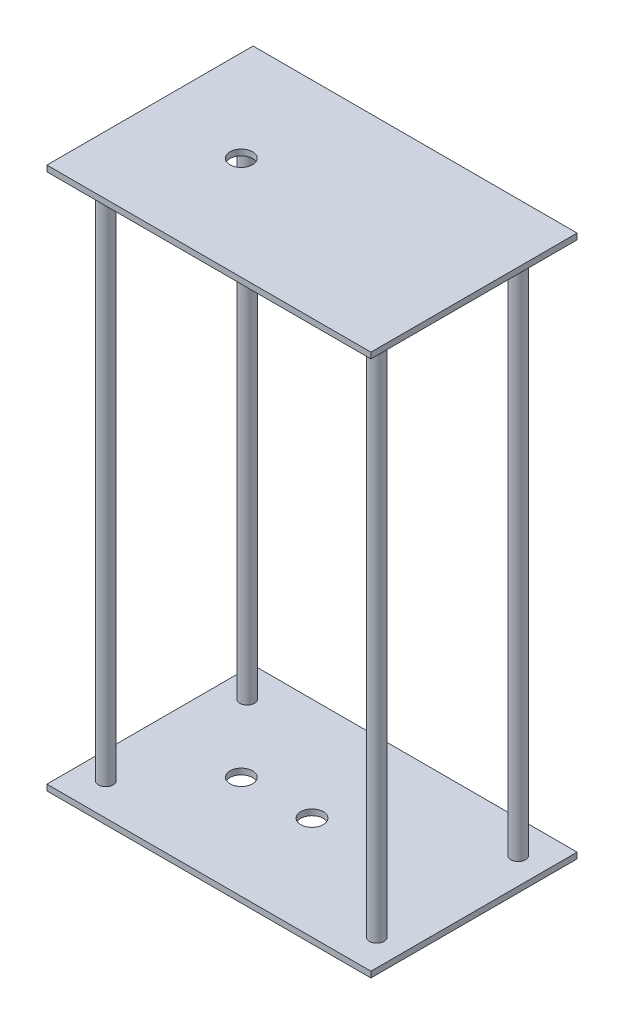
ISO-10303-21;
HEADER;
FILE_DESCRIPTION(('STEP AP214'),'2;1');
FILE_NAME('part.step','',(''),(''),'','','');
FILE_SCHEMA(('AUTOMOTIVE_DESIGN { 1 0 10303 214 1 1 1 1 }'));
ENDSEC;
DATA;
#1=APPLICATION_CONTEXT('core data for automotive mechanical design processes');
#2=APPLICATION_PROTOCOL_DEFINITION('international standard','automotive_design',2000,#1);
#3=PRODUCT_CONTEXT('',#1,'mechanical');
#4=PRODUCT('Part','Part','',(#3));
#5=PRODUCT_RELATED_PRODUCT_CATEGORY('part','',(#4));
#6=PRODUCT_DEFINITION_FORMATION('','',#4);
#7=PRODUCT_DEFINITION_CONTEXT('part definition',#1,'design');
#8=PRODUCT_DEFINITION('design','',#6,#7);
#9=PRODUCT_DEFINITION_SHAPE('','',#8);
#10=(LENGTH_UNIT() NAMED_UNIT(*) SI_UNIT(.MILLI.,.METRE.));
#11=(NAMED_UNIT(*) PLANE_ANGLE_UNIT() SI_UNIT($,.RADIAN.));
#12=(NAMED_UNIT(*) SI_UNIT($,.STERADIAN.) SOLID_ANGLE_UNIT());
#13=UNCERTAINTY_MEASURE_WITH_UNIT(LENGTH_MEASURE(1.E-05),#10,'distance_accuracy_value','');
#14=(GEOMETRIC_REPRESENTATION_CONTEXT(3) GLOBAL_UNCERTAINTY_ASSIGNED_CONTEXT((#13)) GLOBAL_UNIT_ASSIGNED_CONTEXT((#10,
#11,#12)) REPRESENTATION_CONTEXT('',''));
#15=CARTESIAN_POINT('',(0.,0.,0.));
#16=DIRECTION('',(0.,0.,1.));
#17=DIRECTION('',(1.,0.,0.));
#18=AXIS2_PLACEMENT_3D('',#15,#16,#17);
#19=CARTESIAN_POINT('',(-275.,10.,175.));
#20=DIRECTION('',(1.,0.,0.));
#21=DIRECTION('',(0.,0.,-1.));
#22=AXIS2_PLACEMENT_3D('',#19,#20,#21);
#23=PLANE('',#22);
#24=DIRECTION('',(0.,0.,1.));
#25=VECTOR('',#24,1.);
#26=CARTESIAN_POINT('',(-275.,0.,175.));
#27=LINE('',#26,#25);
#28=CARTESIAN_POINT('',(-275.,0.,-175.));
#29=VERTEX_POINT('',#28);
#30=CARTESIAN_POINT('',(-275.,0.,175.));
#31=VERTEX_POINT('',#30);
#32=EDGE_CURVE('E202',#29,#31,#27,.T.);
#33=ORIENTED_EDGE('',*,*,#32,.T.);
#34=DIRECTION('',(0.,-1.,0.));
#35=VECTOR('',#34,1.);
#36=CARTESIAN_POINT('',(-275.,10.,175.));
#37=LINE('',#36,#35);
#38=CARTESIAN_POINT('',(-275.,10.,175.));
#39=VERTEX_POINT('',#38);
#40=EDGE_CURVE('E11',#39,#31,#37,.T.);
#41=ORIENTED_EDGE('',*,*,#40,.F.);
#42=DIRECTION('',(0.,0.,1.));
#43=VECTOR('',#42,1.);
#44=CARTESIAN_POINT('',(-275.,10.,175.));
#45=LINE('',#44,#43);
#46=CARTESIAN_POINT('',(-275.,10.,-175.));
#47=VERTEX_POINT('',#46);
#48=EDGE_CURVE('E206',#47,#39,#45,.T.);
#49=ORIENTED_EDGE('',*,*,#48,.F.);
#50=DIRECTION('',(0.,-1.,0.));
#51=VECTOR('',#50,1.);
#52=CARTESIAN_POINT('',(-275.,10.,-175.));
#53=LINE('',#52,#51);
#54=EDGE_CURVE('E216',#47,#29,#53,.T.);
#55=ORIENTED_EDGE('',*,*,#54,.T.);
#56=EDGE_LOOP('',(#33,#41,#49,#55));
#57=FACE_BOUND('',#56,.T.);
#58=ADVANCED_FACE('F41',(#57),#23,.F.);
#59=CARTESIAN_POINT('',(275.,10.,175.));
#60=DIRECTION('',(0.,0.,-1.));
#61=DIRECTION('',(-1.,0.,0.));
#62=AXIS2_PLACEMENT_3D('',#59,#60,#61);
#63=PLANE('',#62);
#64=DIRECTION('',(1.,0.,0.));
#65=VECTOR('',#64,1.);
#66=CARTESIAN_POINT('',(275.,0.,175.));
#67=LINE('',#66,#65);
#68=CARTESIAN_POINT('',(275.,0.,175.));
#69=VERTEX_POINT('',#68);
#70=EDGE_CURVE('E220',#31,#69,#67,.T.);
#71=ORIENTED_EDGE('',*,*,#70,.T.);
#72=DIRECTION('',(0.,-1.,0.));
#73=VECTOR('',#72,1.);
#74=CARTESIAN_POINT('',(275.,10.,175.));
#75=LINE('',#74,#73);
#76=CARTESIAN_POINT('',(275.,10.,175.));
#77=VERTEX_POINT('',#76);
#78=EDGE_CURVE('E50',#77,#69,#75,.T.);
#79=ORIENTED_EDGE('',*,*,#78,.F.);
#80=DIRECTION('',(1.,0.,0.));
#81=VECTOR('',#80,1.);
#82=CARTESIAN_POINT('',(275.,10.,175.));
#83=LINE('',#82,#81);
#84=EDGE_CURVE('E89',#39,#77,#83,.T.);
#85=ORIENTED_EDGE('',*,*,#84,.F.);
#86=ORIENTED_EDGE('',*,*,#40,.T.);
#87=EDGE_LOOP('',(#71,#79,#85,#86));
#88=FACE_BOUND('',#87,.T.);
#89=ADVANCED_FACE('F250',(#88),#63,.F.);
#90=CARTESIAN_POINT('',(275.,10.,175.));
#91=DIRECTION('',(-1.,0.,0.));
#92=DIRECTION('',(0.,0.,1.));
#93=AXIS2_PLACEMENT_3D('',#90,#91,#92);
#94=PLANE('',#93);
#95=DIRECTION('',(0.,0.,-1.));
#96=VECTOR('',#95,1.);
#97=CARTESIAN_POINT('',(275.,0.,175.));
#98=LINE('',#97,#96);
#99=CARTESIAN_POINT('',(275.,0.,-175.));
#100=VERTEX_POINT('',#99);
#101=EDGE_CURVE('E76',#69,#100,#98,.T.);
#102=ORIENTED_EDGE('',*,*,#101,.T.);
#103=DIRECTION('',(0.,-1.,0.));
#104=VECTOR('',#103,1.);
#105=CARTESIAN_POINT('',(275.,10.,-175.));
#106=LINE('',#105,#104);
#107=CARTESIAN_POINT('',(275.,10.,-175.));
#108=VERTEX_POINT('',#107);
#109=EDGE_CURVE('E229',#108,#100,#106,.T.);
#110=ORIENTED_EDGE('',*,*,#109,.F.);
#111=DIRECTION('',(0.,0.,-1.));
#112=VECTOR('',#111,1.);
#113=CARTESIAN_POINT('',(275.,10.,175.));
#114=LINE('',#113,#112);
#115=EDGE_CURVE('E211',#77,#108,#114,.T.);
#116=ORIENTED_EDGE('',*,*,#115,.F.);
#117=ORIENTED_EDGE('',*,*,#78,.T.);
#118=EDGE_LOOP('',(#102,#110,#116,#117));
#119=FACE_BOUND('',#118,.T.);
#120=ADVANCED_FACE('F233',(#119),#94,.F.);
#121=CARTESIAN_POINT('',(275.,10.,-175.));
#122=DIRECTION('',(0.,0.,1.));
#123=DIRECTION('',(1.,0.,0.));
#124=AXIS2_PLACEMENT_3D('',#121,#122,#123);
#125=PLANE('',#124);
#126=DIRECTION('',(-1.,0.,0.));
#127=VECTOR('',#126,1.);
#128=CARTESIAN_POINT('',(275.,0.,-175.));
#129=LINE('',#128,#127);
#130=EDGE_CURVE('E82',#100,#29,#129,.T.);
#131=ORIENTED_EDGE('',*,*,#130,.T.);
#132=ORIENTED_EDGE('',*,*,#54,.F.);
#133=DIRECTION('',(-1.,0.,0.));
#134=VECTOR('',#133,1.);
#135=CARTESIAN_POINT('',(275.,10.,-175.));
#136=LINE('',#135,#134);
#137=EDGE_CURVE('E58',#108,#47,#136,.T.);
#138=ORIENTED_EDGE('',*,*,#137,.F.);
#139=ORIENTED_EDGE('',*,*,#109,.T.);
#140=EDGE_LOOP('',(#131,#132,#138,#139));
#141=FACE_BOUND('',#140,.T.);
#142=ADVANCED_FACE('F240',(#141),#125,.F.);
#143=CARTESIAN_POINT('',(0.,10.,0.));
#144=DIRECTION('',(0.,1.,0.));
#145=DIRECTION('',(0.,0.,1.));
#146=AXIS2_PLACEMENT_3D('',#143,#144,#145);
#147=PLANE('',#146);
#148=CARTESIAN_POINT('',(0.,10.,0.));
#149=DIRECTION('',(0.,1.,0.));
#150=DIRECTION('',(0.,0.,1.));
#151=AXIS2_PLACEMENT_3D('',#148,#149,#150);
#152=CIRCLE('',#151,19.15);
#153=CARTESIAN_POINT('',(0.,10.,19.15));
#154=VERTEX_POINT('',#153);
#155=EDGE_CURVE('E426',#154,#154,#152,.T.);
#156=ORIENTED_EDGE('',*,*,#155,.F.);
#157=EDGE_LOOP('',(#156));
#158=FACE_BOUND('',#157,.T.);
#159=CARTESIAN_POINT('',(-120.,10.,0.));
#160=DIRECTION('',(0.,1.,0.));
#161=DIRECTION('',(0.,0.,1.));
#162=AXIS2_PLACEMENT_3D('',#159,#160,#161);
#163=CIRCLE('',#162,19.15);
#164=CARTESIAN_POINT('',(-120.,10.,19.15));
#165=VERTEX_POINT('',#164);
#166=EDGE_CURVE('E435',#165,#165,#163,.T.);
#167=ORIENTED_EDGE('',*,*,#166,.F.);
#168=EDGE_LOOP('',(#167));
#169=FACE_BOUND('',#168,.T.);
#170=CARTESIAN_POINT('',(230.,10.,-120.));
#171=DIRECTION('',(0.,1.,0.));
#172=DIRECTION('',(0.,0.,1.));
#173=AXIS2_PLACEMENT_3D('',#170,#171,#172);
#174=CIRCLE('',#173,12.5);
#175=CARTESIAN_POINT('',(230.,10.,-107.5));
#176=VERTEX_POINT('',#175);
#177=EDGE_CURVE('E168',#176,#176,#174,.T.);
#178=ORIENTED_EDGE('',*,*,#177,.F.);
#179=EDGE_LOOP('',(#178));
#180=FACE_BOUND('',#179,.T.);
#181=CARTESIAN_POINT('',(230.,10.,120.));
#182=DIRECTION('',(0.,1.,0.));
#183=DIRECTION('',(0.,0.,1.));
#184=AXIS2_PLACEMENT_3D('',#181,#182,#183);
#185=CIRCLE('',#184,12.5);
#186=CARTESIAN_POINT('',(230.,10.,132.5));
#187=VERTEX_POINT('',#186);
#188=EDGE_CURVE('E178',#187,#187,#185,.T.);
#189=ORIENTED_EDGE('',*,*,#188,.F.);
#190=EDGE_LOOP('',(#189));
#191=FACE_BOUND('',#190,.T.);
#192=CARTESIAN_POINT('',(-230.,10.,120.));
#193=DIRECTION('',(0.,1.,0.));
#194=DIRECTION('',(0.,0.,1.));
#195=AXIS2_PLACEMENT_3D('',#192,#193,#194);
#196=CIRCLE('',#195,12.5);
#197=CARTESIAN_POINT('',(-230.,10.,132.5));
#198=VERTEX_POINT('',#197);
#199=EDGE_CURVE('E186',#198,#198,#196,.T.);
#200=ORIENTED_EDGE('',*,*,#199,.F.);
#201=EDGE_LOOP('',(#200));
#202=FACE_BOUND('',#201,.T.);
#203=CARTESIAN_POINT('',(-230.,10.,-120.));
#204=DIRECTION('',(0.,1.,0.));
#205=DIRECTION('',(0.,0.,1.));
#206=AXIS2_PLACEMENT_3D('',#203,#204,#205);
#207=CIRCLE('',#206,12.5);
#208=CARTESIAN_POINT('',(-230.,10.,-107.5));
#209=VERTEX_POINT('',#208);
#210=EDGE_CURVE('E194',#209,#209,#207,.T.);
#211=ORIENTED_EDGE('',*,*,#210,.F.);
#212=EDGE_LOOP('',(#211));
#213=FACE_BOUND('',#212,.T.);
#214=ORIENTED_EDGE('',*,*,#48,.T.);
#215=ORIENTED_EDGE('',*,*,#84,.T.);
#216=ORIENTED_EDGE('',*,*,#115,.T.);
#217=ORIENTED_EDGE('',*,*,#137,.T.);
#218=EDGE_LOOP('',(#214,#215,#216,#217));
#219=FACE_BOUND('',#218,.T.);
#220=ADVANCED_FACE('F242',(#158,#169,#180,#191,#202,#213,#219),#147,.T.);
#221=CARTESIAN_POINT('',(0.,0.,0.));
#222=DIRECTION('',(0.,1.,0.));
#223=DIRECTION('',(0.,0.,1.));
#224=AXIS2_PLACEMENT_3D('',#221,#222,#223);
#225=PLANE('',#224);
#226=CARTESIAN_POINT('',(0.,0.,0.));
#227=DIRECTION('',(0.,1.,0.));
#228=DIRECTION('',(0.,0.,1.));
#229=AXIS2_PLACEMENT_3D('',#226,#227,#228);
#230=CIRCLE('',#229,19.15);
#231=CARTESIAN_POINT('',(0.,0.,19.15));
#232=VERTEX_POINT('',#231);
#233=EDGE_CURVE('E432',#232,#232,#230,.F.);
#234=ORIENTED_EDGE('',*,*,#233,.F.);
#235=EDGE_LOOP('',(#234));
#236=FACE_BOUND('',#235,.T.);
#237=CARTESIAN_POINT('',(-120.,0.,0.));
#238=DIRECTION('',(0.,1.,0.));
#239=DIRECTION('',(0.,0.,1.));
#240=AXIS2_PLACEMENT_3D('',#237,#238,#239);
#241=CIRCLE('',#240,19.15);
#242=CARTESIAN_POINT('',(-120.,0.,19.15));
#243=VERTEX_POINT('',#242);
#244=EDGE_CURVE('E151',#243,#243,#241,.F.);
#245=ORIENTED_EDGE('',*,*,#244,.F.);
#246=EDGE_LOOP('',(#245));
#247=FACE_BOUND('',#246,.T.);
#248=ORIENTED_EDGE('',*,*,#32,.F.);
#249=ORIENTED_EDGE('',*,*,#130,.F.);
#250=ORIENTED_EDGE('',*,*,#101,.F.);
#251=ORIENTED_EDGE('',*,*,#70,.F.);
#252=EDGE_LOOP('',(#248,#249,#250,#251));
#253=FACE_BOUND('',#252,.T.);
#254=ADVANCED_FACE('F236',(#236,#247,#253),#225,.F.);
#255=CARTESIAN_POINT('',(-230.,910.,-120.));
#256=DIRECTION('',(0.,-1.,0.));
#257=DIRECTION('',(0.,0.,-1.));
#258=AXIS2_PLACEMENT_3D('',#255,#256,#257);
#259=CYLINDRICAL_SURFACE('',#258,12.5);
#260=CARTESIAN_POINT('',(-230.,910.,-120.));
#261=DIRECTION('',(0.,1.,0.));
#262=DIRECTION('',(0.,0.,1.));
#263=AXIS2_PLACEMENT_3D('',#260,#261,#262);
#264=CIRCLE('',#263,12.5);
#265=CARTESIAN_POINT('',(-230.,910.,-107.5));
#266=VERTEX_POINT('',#265);
#267=EDGE_CURVE('E198',#266,#266,#264,.T.);
#268=ORIENTED_EDGE('',*,*,#267,.F.);
#269=EDGE_LOOP('',(#268));
#270=FACE_BOUND('',#269,.T.);
#271=ORIENTED_EDGE('',*,*,#210,.T.);
#272=EDGE_LOOP('',(#271));
#273=FACE_BOUND('',#272,.T.);
#274=ADVANCED_FACE('F273',(#270,#273),#259,.T.);
#275=CARTESIAN_POINT('',(-230.,910.,120.));
#276=DIRECTION('',(0.,-1.,0.));
#277=DIRECTION('',(0.,0.,-1.));
#278=AXIS2_PLACEMENT_3D('',#275,#276,#277);
#279=CYLINDRICAL_SURFACE('',#278,12.5);
#280=CARTESIAN_POINT('',(-230.,910.,120.));
#281=DIRECTION('',(0.,1.,0.));
#282=DIRECTION('',(0.,0.,1.));
#283=AXIS2_PLACEMENT_3D('',#280,#281,#282);
#284=CIRCLE('',#283,12.5);
#285=CARTESIAN_POINT('',(-230.,910.,132.5));
#286=VERTEX_POINT('',#285);
#287=EDGE_CURVE('E190',#286,#286,#284,.T.);
#288=ORIENTED_EDGE('',*,*,#287,.F.);
#289=EDGE_LOOP('',(#288));
#290=FACE_BOUND('',#289,.T.);
#291=ORIENTED_EDGE('',*,*,#199,.T.);
#292=EDGE_LOOP('',(#291));
#293=FACE_BOUND('',#292,.T.);
#294=ADVANCED_FACE('F278',(#290,#293),#279,.T.);
#295=CARTESIAN_POINT('',(230.,910.,120.));
#296=DIRECTION('',(0.,-1.,0.));
#297=DIRECTION('',(0.,0.,-1.));
#298=AXIS2_PLACEMENT_3D('',#295,#296,#297);
#299=CYLINDRICAL_SURFACE('',#298,12.5);
#300=CARTESIAN_POINT('',(230.,910.,120.));
#301=DIRECTION('',(0.,1.,0.));
#302=DIRECTION('',(0.,0.,1.));
#303=AXIS2_PLACEMENT_3D('',#300,#301,#302);
#304=CIRCLE('',#303,12.5);
#305=CARTESIAN_POINT('',(230.,910.,132.5));
#306=VERTEX_POINT('',#305);
#307=EDGE_CURVE('E182',#306,#306,#304,.T.);
#308=ORIENTED_EDGE('',*,*,#307,.F.);
#309=EDGE_LOOP('',(#308));
#310=FACE_BOUND('',#309,.T.);
#311=ORIENTED_EDGE('',*,*,#188,.T.);
#312=EDGE_LOOP('',(#311));
#313=FACE_BOUND('',#312,.T.);
#314=ADVANCED_FACE('F290',(#310,#313),#299,.T.);
#315=CARTESIAN_POINT('',(230.,910.,-120.));
#316=DIRECTION('',(0.,-1.,0.));
#317=DIRECTION('',(0.,0.,-1.));
#318=AXIS2_PLACEMENT_3D('',#315,#316,#317);
#319=CYLINDRICAL_SURFACE('',#318,12.5);
#320=CARTESIAN_POINT('',(230.,910.,-120.));
#321=DIRECTION('',(0.,1.,0.));
#322=DIRECTION('',(0.,0.,1.));
#323=AXIS2_PLACEMENT_3D('',#320,#321,#322);
#324=CIRCLE('',#323,12.5);
#325=CARTESIAN_POINT('',(230.,910.,-107.5));
#326=VERTEX_POINT('',#325);
#327=EDGE_CURVE('E174',#326,#326,#324,.T.);
#328=ORIENTED_EDGE('',*,*,#327,.F.);
#329=EDGE_LOOP('',(#328));
#330=FACE_BOUND('',#329,.T.);
#331=ORIENTED_EDGE('',*,*,#177,.T.);
#332=EDGE_LOOP('',(#331));
#333=FACE_BOUND('',#332,.T.);
#334=ADVANCED_FACE('F300',(#330,#333),#319,.T.);
#335=CARTESIAN_POINT('',(-230.,920.,175.));
#336=DIRECTION('',(0.,0.,1.));
#337=DIRECTION('',(1.,0.,0.));
#338=AXIS2_PLACEMENT_3D('',#335,#336,#337);
#339=PLANE('',#338);
#340=DIRECTION('',(-1.,0.,0.));
#341=VECTOR('',#340,1.);
#342=CARTESIAN_POINT('',(-230.,910.,175.));
#343=LINE('',#342,#341);
#344=CARTESIAN_POINT('',(275.,910.,175.));
#345=VERTEX_POINT('',#344);
#346=CARTESIAN_POINT('',(-275.,910.,175.));
#347=VERTEX_POINT('',#346);
#348=EDGE_CURVE('E158',#345,#347,#343,.T.);
#349=ORIENTED_EDGE('',*,*,#348,.F.);
#350=DIRECTION('',(0.,-1.,0.));
#351=VECTOR('',#350,1.);
#352=CARTESIAN_POINT('',(275.,920.,175.));
#353=LINE('',#352,#351);
#354=CARTESIAN_POINT('',(275.,920.,175.));
#355=VERTEX_POINT('',#354);
#356=EDGE_CURVE('E142',#355,#345,#353,.T.);
#357=ORIENTED_EDGE('',*,*,#356,.F.);
#358=DIRECTION('',(-1.,0.,0.));
#359=VECTOR('',#358,1.);
#360=CARTESIAN_POINT('',(-230.,920.,175.));
#361=LINE('',#360,#359);
#362=CARTESIAN_POINT('',(-275.,920.,175.));
#363=VERTEX_POINT('',#362);
#364=EDGE_CURVE('E135',#355,#363,#361,.T.);
#365=ORIENTED_EDGE('',*,*,#364,.T.);
#366=DIRECTION('',(0.,-1.,0.));
#367=VECTOR('',#366,1.);
#368=CARTESIAN_POINT('',(-275.,920.,175.));
#369=LINE('',#368,#367);
#370=EDGE_CURVE('E116',#363,#347,#369,.T.);
#371=ORIENTED_EDGE('',*,*,#370,.T.);
#372=EDGE_LOOP('',(#349,#357,#365,#371));
#373=FACE_BOUND('',#372,.T.);
#374=ADVANCED_FACE('F141',(#373),#339,.T.);
#375=CARTESIAN_POINT('',(275.,920.,120.));
#376=DIRECTION('',(1.,0.,0.));
#377=DIRECTION('',(0.,0.,-1.));
#378=AXIS2_PLACEMENT_3D('',#375,#376,#377);
#379=PLANE('',#378);
#380=DIRECTION('',(0.,0.,1.));
#381=VECTOR('',#380,1.);
#382=CARTESIAN_POINT('',(275.,910.,120.));
#383=LINE('',#382,#381);
#384=CARTESIAN_POINT('',(275.,910.,-175.));
#385=VERTEX_POINT('',#384);
#386=EDGE_CURVE('E144',#385,#345,#383,.T.);
#387=ORIENTED_EDGE('',*,*,#386,.F.);
#388=DIRECTION('',(0.,-1.,0.));
#389=VECTOR('',#388,1.);
#390=CARTESIAN_POINT('',(275.,920.,-175.));
#391=LINE('',#390,#389);
#392=CARTESIAN_POINT('',(275.,920.,-175.));
#393=VERTEX_POINT('',#392);
#394=EDGE_CURVE('E169',#393,#385,#391,.T.);
#395=ORIENTED_EDGE('',*,*,#394,.F.);
#396=DIRECTION('',(0.,0.,1.));
#397=VECTOR('',#396,1.);
#398=CARTESIAN_POINT('',(275.,920.,120.));
#399=LINE('',#398,#397);
#400=EDGE_CURVE('E128',#393,#355,#399,.T.);
#401=ORIENTED_EDGE('',*,*,#400,.T.);
#402=ORIENTED_EDGE('',*,*,#356,.T.);
#403=EDGE_LOOP('',(#387,#395,#401,#402));
#404=FACE_BOUND('',#403,.T.);
#405=ADVANCED_FACE('F319',(#404),#379,.T.);
#406=CARTESIAN_POINT('',(-230.,920.,-175.));
#407=DIRECTION('',(0.,0.,-1.));
#408=DIRECTION('',(-1.,0.,0.));
#409=AXIS2_PLACEMENT_3D('',#406,#407,#408);
#410=PLANE('',#409);
#411=DIRECTION('',(1.,0.,0.));
#412=VECTOR('',#411,1.);
#413=CARTESIAN_POINT('',(-230.,910.,-175.));
#414=LINE('',#413,#412);
#415=CARTESIAN_POINT('',(-275.,910.,-175.));
#416=VERTEX_POINT('',#415);
#417=EDGE_CURVE('E148',#416,#385,#414,.T.);
#418=ORIENTED_EDGE('',*,*,#417,.F.);
#419=DIRECTION('',(0.,-1.,0.));
#420=VECTOR('',#419,1.);
#421=CARTESIAN_POINT('',(-275.,920.,-175.));
#422=LINE('',#421,#420);
#423=CARTESIAN_POINT('',(-275.,920.,-175.));
#424=VERTEX_POINT('',#423);
#425=EDGE_CURVE('E127',#424,#416,#422,.T.);
#426=ORIENTED_EDGE('',*,*,#425,.F.);
#427=DIRECTION('',(1.,0.,0.));
#428=VECTOR('',#427,1.);
#429=CARTESIAN_POINT('',(-230.,920.,-175.));
#430=LINE('',#429,#428);
#431=EDGE_CURVE('E138',#424,#393,#430,.T.);
#432=ORIENTED_EDGE('',*,*,#431,.T.);
#433=ORIENTED_EDGE('',*,*,#394,.T.);
#434=EDGE_LOOP('',(#418,#426,#432,#433));
#435=FACE_BOUND('',#434,.T.);
#436=ADVANCED_FACE('F328',(#435),#410,.T.);
#437=CARTESIAN_POINT('',(-275.,920.,120.));
#438=DIRECTION('',(-1.,0.,0.));
#439=DIRECTION('',(0.,0.,1.));
#440=AXIS2_PLACEMENT_3D('',#437,#438,#439);
#441=PLANE('',#440);
#442=DIRECTION('',(0.,0.,-1.));
#443=VECTOR('',#442,1.);
#444=CARTESIAN_POINT('',(-275.,910.,120.));
#445=LINE('',#444,#443);
#446=EDGE_CURVE('E121',#347,#416,#445,.T.);
#447=ORIENTED_EDGE('',*,*,#446,.F.);
#448=ORIENTED_EDGE('',*,*,#370,.F.);
#449=DIRECTION('',(0.,0.,-1.));
#450=VECTOR('',#449,1.);
#451=CARTESIAN_POINT('',(-275.,920.,120.));
#452=LINE('',#451,#450);
#453=EDGE_CURVE('E119',#363,#424,#452,.T.);
#454=ORIENTED_EDGE('',*,*,#453,.T.);
#455=ORIENTED_EDGE('',*,*,#425,.T.);
#456=EDGE_LOOP('',(#447,#448,#454,#455));
#457=FACE_BOUND('',#456,.T.);
#458=ADVANCED_FACE('F118',(#457),#441,.T.);
#459=CARTESIAN_POINT('',(0.,920.,0.));
#460=DIRECTION('',(0.,-1.,0.));
#461=DIRECTION('',(0.,0.,-1.));
#462=AXIS2_PLACEMENT_3D('',#459,#460,#461);
#463=PLANE('',#462);
#464=CARTESIAN_POINT('',(-120.,920.,0.));
#465=DIRECTION('',(0.,-1.,0.));
#466=DIRECTION('',(0.,0.,-1.));
#467=AXIS2_PLACEMENT_3D('',#464,#465,#466);
#468=CIRCLE('',#467,19.15);
#469=CARTESIAN_POINT('',(-120.,920.,-19.15));
#470=VERTEX_POINT('',#469);
#471=EDGE_CURVE('E422',#470,#470,#468,.T.);
#472=ORIENTED_EDGE('',*,*,#471,.T.);
#473=EDGE_LOOP('',(#472));
#474=FACE_BOUND('',#473,.T.);
#475=ORIENTED_EDGE('',*,*,#364,.F.);
#476=ORIENTED_EDGE('',*,*,#400,.F.);
#477=ORIENTED_EDGE('',*,*,#431,.F.);
#478=ORIENTED_EDGE('',*,*,#453,.F.);
#479=EDGE_LOOP('',(#475,#476,#477,#478));
#480=FACE_BOUND('',#479,.T.);
#481=ADVANCED_FACE('F133',(#474,#480),#463,.F.);
#482=CARTESIAN_POINT('',(0.,910.,0.));
#483=DIRECTION('',(0.,-1.,0.));
#484=DIRECTION('',(0.,0.,-1.));
#485=AXIS2_PLACEMENT_3D('',#482,#483,#484);
#486=PLANE('',#485);
#487=CARTESIAN_POINT('',(-120.,910.,0.));
#488=DIRECTION('',(0.,-1.,0.));
#489=DIRECTION('',(0.,0.,-1.));
#490=AXIS2_PLACEMENT_3D('',#487,#488,#489);
#491=CIRCLE('',#490,19.15);
#492=CARTESIAN_POINT('',(-120.,910.,-19.15));
#493=VERTEX_POINT('',#492);
#494=EDGE_CURVE('E419',#493,#493,#491,.T.);
#495=ORIENTED_EDGE('',*,*,#494,.F.);
#496=EDGE_LOOP('',(#495));
#497=FACE_BOUND('',#496,.T.);
#498=ORIENTED_EDGE('',*,*,#267,.T.);
#499=EDGE_LOOP('',(#498));
#500=FACE_BOUND('',#499,.T.);
#501=ORIENTED_EDGE('',*,*,#287,.T.);
#502=EDGE_LOOP('',(#501));
#503=FACE_BOUND('',#502,.T.);
#504=ORIENTED_EDGE('',*,*,#307,.T.);
#505=EDGE_LOOP('',(#504));
#506=FACE_BOUND('',#505,.T.);
#507=ORIENTED_EDGE('',*,*,#327,.T.);
#508=EDGE_LOOP('',(#507));
#509=FACE_BOUND('',#508,.T.);
#510=ORIENTED_EDGE('',*,*,#348,.T.);
#511=ORIENTED_EDGE('',*,*,#446,.T.);
#512=ORIENTED_EDGE('',*,*,#417,.T.);
#513=ORIENTED_EDGE('',*,*,#386,.T.);
#514=EDGE_LOOP('',(#510,#511,#512,#513));
#515=FACE_BOUND('',#514,.T.);
#516=ADVANCED_FACE('F360',(#497,#500,#503,#506,#509,#515),#486,.T.);
#517=CARTESIAN_POINT('',(-120.,-0.000999999999999265,0.));
#518=DIRECTION('',(0.,1.,0.));
#519=DIRECTION('',(0.,0.,1.));
#520=AXIS2_PLACEMENT_3D('',#517,#518,#519);
#521=CYLINDRICAL_SURFACE('',#520,19.15);
#522=ORIENTED_EDGE('',*,*,#166,.T.);
#523=EDGE_LOOP('',(#522));
#524=FACE_BOUND('',#523,.T.);
#525=ORIENTED_EDGE('',*,*,#244,.T.);
#526=EDGE_LOOP('',(#525));
#527=FACE_BOUND('',#526,.T.);
#528=ADVANCED_FACE('F353',(#524,#527),#521,.F.);
#529=CARTESIAN_POINT('',(0.,-0.000999999999999265,0.));
#530=DIRECTION('',(0.,1.,0.));
#531=DIRECTION('',(0.,0.,1.));
#532=AXIS2_PLACEMENT_3D('',#529,#530,#531);
#533=CYLINDRICAL_SURFACE('',#532,19.15);
#534=ORIENTED_EDGE('',*,*,#155,.T.);
#535=EDGE_LOOP('',(#534));
#536=FACE_BOUND('',#535,.T.);
#537=ORIENTED_EDGE('',*,*,#233,.T.);
#538=EDGE_LOOP('',(#537));
#539=FACE_BOUND('',#538,.T.);
#540=ADVANCED_FACE('F359',(#536,#539),#533,.F.);
#541=CARTESIAN_POINT('',(-120.,920.001,0.));
#542=DIRECTION('',(0.,-1.,0.));
#543=DIRECTION('',(0.,0.,-1.));
#544=AXIS2_PLACEMENT_3D('',#541,#542,#543);
#545=CYLINDRICAL_SURFACE('',#544,19.15);
#546=CARTESIAN_POINT('',(-120.,910.,-19.15));
#547=CARTESIAN_POINT('',(-120.,910.104166666667,-19.15));
#548=CARTESIAN_POINT('',(-120.,910.208333333333,-19.15));
#549=CARTESIAN_POINT('',(-120.,910.416666666667,-19.15));
#550=CARTESIAN_POINT('',(-120.,910.520833333333,-19.15));
#551=CARTESIAN_POINT('',(-120.,910.729166666667,-19.15));
#552=CARTESIAN_POINT('',(-120.,910.833333333333,-19.15));
#553=CARTESIAN_POINT('',(-120.,911.041666666667,-19.15));
#554=CARTESIAN_POINT('',(-120.,911.145833333333,-19.15));
#555=CARTESIAN_POINT('',(-120.,911.354166666667,-19.15));
#556=CARTESIAN_POINT('',(-120.,911.458333333333,-19.15));
#557=CARTESIAN_POINT('',(-120.,911.666666666667,-19.15));
#558=CARTESIAN_POINT('',(-120.,911.770833333333,-19.15));
#559=CARTESIAN_POINT('',(-120.,911.979166666667,-19.15));
#560=CARTESIAN_POINT('',(-120.,912.083333333333,-19.15));
#561=CARTESIAN_POINT('',(-120.,912.291666666667,-19.15));
#562=CARTESIAN_POINT('',(-120.,912.395833333333,-19.15));
#563=CARTESIAN_POINT('',(-120.,912.604166666667,-19.15));
#564=CARTESIAN_POINT('',(-120.,912.708333333333,-19.15));
#565=CARTESIAN_POINT('',(-120.,912.916666666667,-19.15));
#566=CARTESIAN_POINT('',(-120.,913.020833333333,-19.15));
#567=CARTESIAN_POINT('',(-120.,913.229166666667,-19.15));
#568=CARTESIAN_POINT('',(-120.,913.333333333333,-19.15));
#569=CARTESIAN_POINT('',(-120.,913.541666666667,-19.15));
#570=CARTESIAN_POINT('',(-120.,913.645833333333,-19.15));
#571=CARTESIAN_POINT('',(-120.,913.854166666667,-19.15));
#572=CARTESIAN_POINT('',(-120.,913.958333333333,-19.15));
#573=CARTESIAN_POINT('',(-120.,914.166666666667,-19.15));
#574=CARTESIAN_POINT('',(-120.,914.270833333333,-19.15));
#575=CARTESIAN_POINT('',(-120.,914.479166666667,-19.15));
#576=CARTESIAN_POINT('',(-120.,914.583333333333,-19.15));
#577=CARTESIAN_POINT('',(-120.,914.791666666667,-19.15));
#578=CARTESIAN_POINT('',(-120.,914.895833333333,-19.15));
#579=CARTESIAN_POINT('',(-120.,915.104166666667,-19.15));
#580=CARTESIAN_POINT('',(-120.,915.208333333333,-19.15));
#581=CARTESIAN_POINT('',(-120.,915.416666666667,-19.15));
#582=CARTESIAN_POINT('',(-120.,915.520833333333,-19.15));
#583=CARTESIAN_POINT('',(-120.,915.729166666667,-19.15));
#584=CARTESIAN_POINT('',(-120.,915.833333333333,-19.15));
#585=CARTESIAN_POINT('',(-120.,916.041666666667,-19.15));
#586=CARTESIAN_POINT('',(-120.,916.145833333333,-19.15));
#587=CARTESIAN_POINT('',(-120.,916.354166666667,-19.15));
#588=CARTESIAN_POINT('',(-120.,916.458333333333,-19.15));
#589=CARTESIAN_POINT('',(-120.,916.666666666667,-19.15));
#590=CARTESIAN_POINT('',(-120.,916.770833333333,-19.15));
#591=CARTESIAN_POINT('',(-120.,916.979166666667,-19.15));
#592=CARTESIAN_POINT('',(-120.,917.083333333333,-19.15));
#593=CARTESIAN_POINT('',(-120.,917.291666666667,-19.15));
#594=CARTESIAN_POINT('',(-120.,917.395833333333,-19.15));
#595=CARTESIAN_POINT('',(-120.,917.604166666667,-19.15));
#596=CARTESIAN_POINT('',(-120.,917.708333333333,-19.15));
#597=CARTESIAN_POINT('',(-120.,917.916666666667,-19.15));
#598=CARTESIAN_POINT('',(-120.,918.020833333333,-19.15));
#599=CARTESIAN_POINT('',(-120.,918.229166666667,-19.15));
#600=CARTESIAN_POINT('',(-120.,918.333333333333,-19.15));
#601=CARTESIAN_POINT('',(-120.,918.541666666667,-19.15));
#602=CARTESIAN_POINT('',(-120.,918.645833333333,-19.15));
#603=CARTESIAN_POINT('',(-120.,918.854166666667,-19.15));
#604=CARTESIAN_POINT('',(-120.,918.958333333333,-19.15));
#605=CARTESIAN_POINT('',(-120.,919.166666666667,-19.15));
#606=CARTESIAN_POINT('',(-120.,919.270833333333,-19.15));
#607=CARTESIAN_POINT('',(-120.,919.479166666667,-19.15));
#608=CARTESIAN_POINT('',(-120.,919.583333333333,-19.15));
#609=CARTESIAN_POINT('',(-120.,919.791666666667,-19.15));
#610=CARTESIAN_POINT('',(-120.,919.895833333333,-19.15));
#611=CARTESIAN_POINT('',(-120.,920.,-19.15));
#612=B_SPLINE_CURVE_WITH_KNOTS('',3,(#546,#547,#548,#549,#550,#551,#552,#553,#554,#555,#556,
#557,#558,#559,#560,#561,#562,#563,#564,#565,#566,#567,#568,#569,#570,#571,#572,#573,#574,#575,
#576,#577,#578,#579,#580,#581,#582,#583,#584,#585,#586,#587,#588,#589,#590,#591,#592,#593,#594,
#595,#596,#597,#598,#599,#600,#601,#602,#603,#604,#605,#606,#607,#608,#609,#610,#611),
.UNSPECIFIED.,.F.,.F.,(4,2,2,2,2,2,2,2,2,2,2,2,2,2,2,2,2,2,2,2,2,2,2,2,2,2,2,2,2,2,2,2,4),(0.,
0.312500000000049,0.625000000000098,0.937500000000036,1.25000000000008,1.56250000000002,
1.87500000000007,2.18750000000001,2.50000000000006,2.81250000000011,3.12500000000004,
3.43750000000009,3.75000000000003,4.06250000000008,4.37500000000002,4.68750000000007,5.,
5.31250000000005,5.6250000000001,5.93750000000004,6.25000000000009,6.56250000000003,
6.87500000000008,7.18750000000001,7.50000000000006,7.81250000000011,8.12500000000005,
8.4375000000001,8.75000000000004,9.06250000000009,9.37500000000002,9.68750000000007,
10.0000000000001),.UNSPECIFIED.);
#613=EDGE_CURVE('BSEAM383',#493,#470,#612,.T.);
#614=ORIENTED_EDGE('',*,*,#494,.T.);
#615=ORIENTED_EDGE('',*,*,#471,.F.);
#616=ORIENTED_EDGE('',*,*,#613,.T.);
#617=ORIENTED_EDGE('',*,*,#613,.F.);
#618=EDGE_LOOP('',(#614,#616,#615,#617));
#619=FACE_BOUND('',#618,.T.);
#620=ADVANCED_FACE('F383',(#619),#545,.F.);
#621=CLOSED_SHELL('',(#58,#89,#120,#142,#220,#254,#274,#294,#314,#334,#374,#405,#436,#458,#481,
#516,#528,#540,#620));
#622=MANIFOLD_SOLID_BREP('B2',#621);
#623=ADVANCED_BREP_SHAPE_REPRESENTATION('',(#18,#622),#14);
#624=SHAPE_DEFINITION_REPRESENTATION(#9,#623);
ENDSEC;
END-ISO-10303-21;
